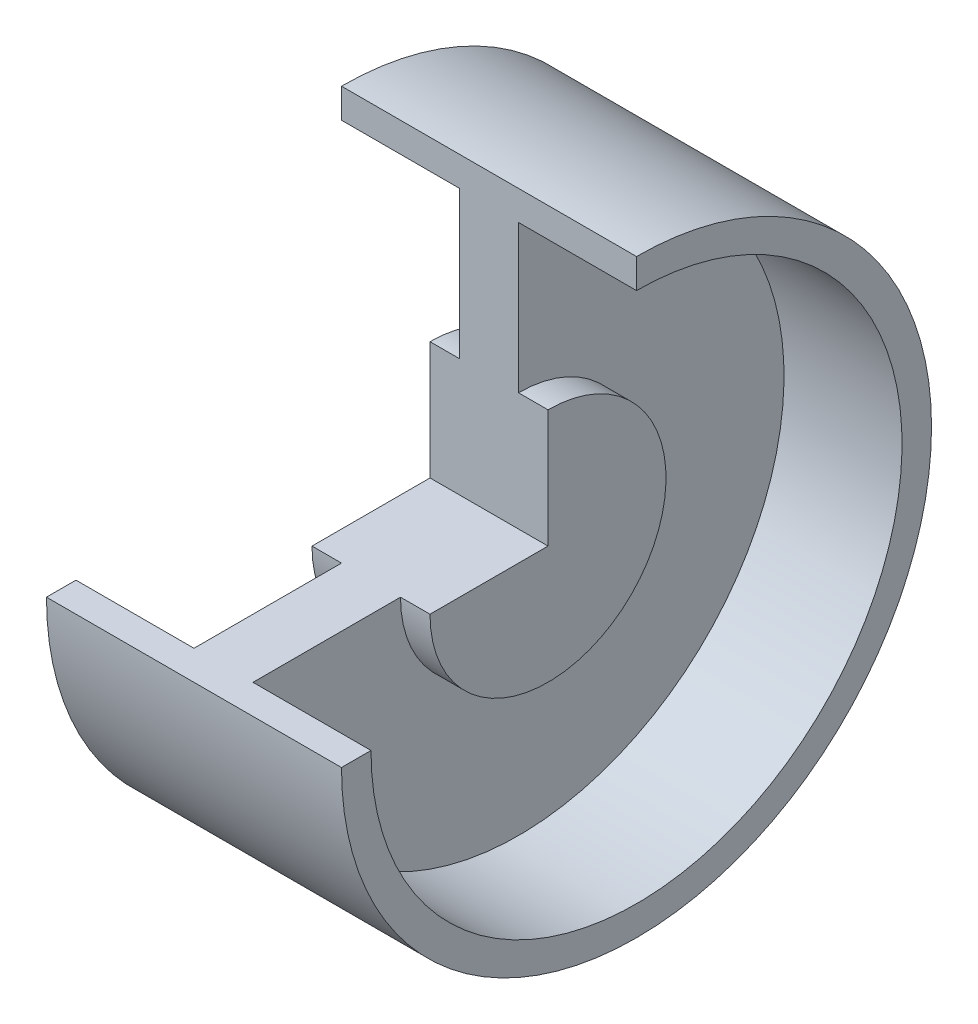
ISO-10303-21;
HEADER;
FILE_DESCRIPTION(('STEP AP214'),'2;1');
FILE_NAME('part.step','',(''),(''),'','','');
FILE_SCHEMA(('AUTOMOTIVE_DESIGN { 1 0 10303 214 1 1 1 1 }'));
ENDSEC;
DATA;
#1=APPLICATION_CONTEXT('core data for automotive mechanical design processes');
#2=APPLICATION_PROTOCOL_DEFINITION('international standard','automotive_design',2000,#1);
#3=PRODUCT_CONTEXT('',#1,'mechanical');
#4=PRODUCT('Part','Part','',(#3));
#5=PRODUCT_RELATED_PRODUCT_CATEGORY('part','',(#4));
#6=PRODUCT_DEFINITION_FORMATION('','',#4);
#7=PRODUCT_DEFINITION_CONTEXT('part definition',#1,'design');
#8=PRODUCT_DEFINITION('design','',#6,#7);
#9=PRODUCT_DEFINITION_SHAPE('','',#8);
#10=(LENGTH_UNIT() NAMED_UNIT(*) SI_UNIT(.MILLI.,.METRE.));
#11=(NAMED_UNIT(*) PLANE_ANGLE_UNIT() SI_UNIT($,.RADIAN.));
#12=(NAMED_UNIT(*) SI_UNIT($,.STERADIAN.) SOLID_ANGLE_UNIT());
#13=UNCERTAINTY_MEASURE_WITH_UNIT(LENGTH_MEASURE(1.E-05),#10,'distance_accuracy_value','');
#14=(GEOMETRIC_REPRESENTATION_CONTEXT(3) GLOBAL_UNCERTAINTY_ASSIGNED_CONTEXT((#13)) GLOBAL_UNIT_ASSIGNED_CONTEXT((#10,
#11,#12)) REPRESENTATION_CONTEXT('',''));
#15=CARTESIAN_POINT('',(0.,0.,0.));
#16=DIRECTION('',(0.,0.,1.));
#17=DIRECTION('',(1.,0.,0.));
#18=AXIS2_PLACEMENT_3D('',#15,#16,#17);
#19=CARTESIAN_POINT('',(-10.,0.,0.));
#20=DIRECTION('',(1.,0.,0.));
#21=DIRECTION('',(0.,1.,0.));
#22=AXIS2_PLACEMENT_3D('',#19,#20,#21);
#23=CYLINDRICAL_SURFACE('',#22,20.);
#24=CARTESIAN_POINT('',(-10.,0.,0.));
#25=DIRECTION('',(1.,0.,0.));
#26=DIRECTION('',(0.,1.,0.));
#27=AXIS2_PLACEMENT_3D('',#24,#25,#26);
#28=CIRCLE('',#27,20.);
#29=CARTESIAN_POINT('',(-10.,2.09488880330588E-13,20.));
#30=VERTEX_POINT('',#29);
#31=CARTESIAN_POINT('',(-10.,20.,0.));
#32=VERTEX_POINT('',#31);
#33=EDGE_CURVE('E11',#30,#32,#28,.T.);
#34=ORIENTED_EDGE('',*,*,#33,.T.);
#35=DIRECTION('',(-1.,0.,0.));
#36=VECTOR('',#35,1.);
#37=CARTESIAN_POINT('',(-5.,20.,0.));
#38=LINE('',#37,#36);
#39=CARTESIAN_POINT('',(-5.,20.,0.));
#40=VERTEX_POINT('',#39);
#41=EDGE_CURVE('E128',#40,#32,#38,.T.);
#42=ORIENTED_EDGE('',*,*,#41,.F.);
#43=CARTESIAN_POINT('',(-4.99999999999999,0.,0.));
#44=DIRECTION('',(1.,0.,0.));
#45=DIRECTION('',(0.,1.,0.));
#46=AXIS2_PLACEMENT_3D('',#43,#44,#45);
#47=CIRCLE('',#46,20.);
#48=CARTESIAN_POINT('',(-4.99999999999999,2.10737743309124E-13,20.));
#49=VERTEX_POINT('',#48);
#50=EDGE_CURVE('E61',#49,#40,#47,.T.);
#51=ORIENTED_EDGE('',*,*,#50,.F.);
#52=DIRECTION('',(-1.,0.,0.));
#53=VECTOR('',#52,1.);
#54=CARTESIAN_POINT('',(-4.99999999999999,2.10737743309124E-13,20.));
#55=LINE('',#54,#53);
#56=EDGE_CURVE('E130',#49,#30,#55,.T.);
#57=ORIENTED_EDGE('',*,*,#56,.T.);
#58=EDGE_LOOP('',(#34,#42,#51,#57));
#59=FACE_BOUND('',#58,.T.);
#60=ADVANCED_FACE('F45',(#59),#23,.T.);
#61=CARTESIAN_POINT('',(-10.,2.09488880330588E-13,20.));
#62=DIRECTION('',(-1.,0.,0.));
#63=DIRECTION('',(0.,-1.,0.));
#64=AXIS2_PLACEMENT_3D('',#61,#62,#63);
#65=PLANE('',#64);
#66=DIRECTION('',(0.,-1.,0.));
#67=VECTOR('',#66,1.);
#68=CARTESIAN_POINT('',(-10.,20.,0.));
#69=LINE('',#68,#67);
#70=CARTESIAN_POINT('',(-10.,0.,0.));
#71=VERTEX_POINT('',#70);
#72=EDGE_CURVE('E139',#32,#71,#69,.T.);
#73=ORIENTED_EDGE('',*,*,#72,.F.);
#74=ORIENTED_EDGE('',*,*,#33,.F.);
#75=DIRECTION('',(0.,0.,-1.));
#76=VECTOR('',#75,1.);
#77=CARTESIAN_POINT('',(-10.,2.09488880330588E-13,20.));
#78=LINE('',#77,#76);
#79=EDGE_CURVE('E144',#30,#71,#78,.T.);
#80=ORIENTED_EDGE('',*,*,#79,.T.);
#81=EDGE_LOOP('',(#73,#74,#80));
#82=FACE_BOUND('',#81,.T.);
#83=ADVANCED_FACE('F47',(#82),#65,.T.);
#84=CARTESIAN_POINT('',(10.,0.,0.));
#85=DIRECTION('',(1.,0.,0.));
#86=DIRECTION('',(0.,1.,0.));
#87=AXIS2_PLACEMENT_3D('',#84,#85,#86);
#88=PLANE('',#87);
#89=CARTESIAN_POINT('',(10.,0.,0.));
#90=DIRECTION('',(1.,0.,0.));
#91=DIRECTION('',(0.,1.,0.));
#92=AXIS2_PLACEMENT_3D('',#89,#90,#91);
#93=CIRCLE('',#92,20.);
#94=CARTESIAN_POINT('',(10.,2.14484332244731E-13,20.));
#95=VERTEX_POINT('',#94);
#96=CARTESIAN_POINT('',(10.,20.,0.));
#97=VERTEX_POINT('',#96);
#98=EDGE_CURVE('E54',#95,#97,#93,.T.);
#99=ORIENTED_EDGE('',*,*,#98,.T.);
#100=DIRECTION('',(0.,1.,0.));
#101=VECTOR('',#100,1.);
#102=CARTESIAN_POINT('',(10.,0.,0.));
#103=LINE('',#102,#101);
#104=CARTESIAN_POINT('',(10.,0.,0.));
#105=VERTEX_POINT('',#104);
#106=EDGE_CURVE('E146',#105,#97,#103,.T.);
#107=ORIENTED_EDGE('',*,*,#106,.F.);
#108=DIRECTION('',(0.,0.,1.));
#109=VECTOR('',#108,1.);
#110=CARTESIAN_POINT('',(10.,0.,0.));
#111=LINE('',#110,#109);
#112=EDGE_CURVE('E188',#105,#95,#111,.T.);
#113=ORIENTED_EDGE('',*,*,#112,.T.);
#114=EDGE_LOOP('',(#99,#107,#113));
#115=FACE_BOUND('',#114,.T.);
#116=ADVANCED_FACE('F245',(#115),#88,.T.);
#117=CARTESIAN_POINT('',(-10.,0.,0.));
#118=DIRECTION('',(1.,0.,0.));
#119=DIRECTION('',(0.,1.,0.));
#120=AXIS2_PLACEMENT_3D('',#117,#118,#119);
#121=CYLINDRICAL_SURFACE('',#120,20.);
#122=CARTESIAN_POINT('',(5.00000000000001,0.,0.));
#123=DIRECTION('',(1.,0.,0.));
#124=DIRECTION('',(0.,1.,0.));
#125=AXIS2_PLACEMENT_3D('',#122,#123,#124);
#126=CIRCLE('',#125,20.);
#127=CARTESIAN_POINT('',(5.00000000000001,2.13235469266195E-13,20.));
#128=VERTEX_POINT('',#127);
#129=CARTESIAN_POINT('',(5.,20.,0.));
#130=VERTEX_POINT('',#129);
#131=EDGE_CURVE('E241',#128,#130,#126,.T.);
#132=ORIENTED_EDGE('',*,*,#131,.T.);
#133=DIRECTION('',(-1.,0.,0.));
#134=VECTOR('',#133,1.);
#135=CARTESIAN_POINT('',(10.,20.,0.));
#136=LINE('',#135,#134);
#137=EDGE_CURVE('E150',#97,#130,#136,.T.);
#138=ORIENTED_EDGE('',*,*,#137,.F.);
#139=ORIENTED_EDGE('',*,*,#98,.F.);
#140=DIRECTION('',(-1.,0.,0.));
#141=VECTOR('',#140,1.);
#142=CARTESIAN_POINT('',(10.,2.14484332244731E-13,20.));
#143=LINE('',#142,#141);
#144=EDGE_CURVE('E192',#95,#128,#143,.T.);
#145=ORIENTED_EDGE('',*,*,#144,.T.);
#146=EDGE_LOOP('',(#132,#138,#139,#145));
#147=FACE_BOUND('',#146,.T.);
#148=ADVANCED_FACE('F251',(#147),#121,.T.);
#149=CARTESIAN_POINT('',(5.00000000000001,2.13235469266195E-13,20.));
#150=DIRECTION('',(1.,0.,0.));
#151=DIRECTION('',(0.,1.,0.));
#152=AXIS2_PLACEMENT_3D('',#149,#150,#151);
#153=PLANE('',#152);
#154=CARTESIAN_POINT('',(5.00000000000002,0.,0.));
#155=DIRECTION('',(1.,0.,0.));
#156=DIRECTION('',(0.,1.,0.));
#157=AXIS2_PLACEMENT_3D('',#154,#155,#156);
#158=CIRCLE('',#157,45.);
#159=CARTESIAN_POINT('',(5.00000000000002,4.7509656967943E-13,45.));
#160=VERTEX_POINT('',#159);
#161=CARTESIAN_POINT('',(5.,45.,0.));
#162=VERTEX_POINT('',#161);
#163=EDGE_CURVE('E238',#160,#162,#158,.T.);
#164=ORIENTED_EDGE('',*,*,#163,.T.);
#165=DIRECTION('',(0.,1.,0.));
#166=VECTOR('',#165,1.);
#167=CARTESIAN_POINT('',(5.,20.,0.));
#168=LINE('',#167,#166);
#169=EDGE_CURVE('E156',#130,#162,#168,.T.);
#170=ORIENTED_EDGE('',*,*,#169,.F.);
#171=ORIENTED_EDGE('',*,*,#131,.F.);
#172=DIRECTION('',(0.,0.,1.));
#173=VECTOR('',#172,1.);
#174=CARTESIAN_POINT('',(5.00000000000001,2.13235469266195E-13,20.));
#175=LINE('',#174,#173);
#176=EDGE_CURVE('E196',#128,#160,#175,.T.);
#177=ORIENTED_EDGE('',*,*,#176,.T.);
#178=EDGE_LOOP('',(#164,#170,#171,#177));
#179=FACE_BOUND('',#178,.T.);
#180=ADVANCED_FACE('F254',(#179),#153,.T.);
#181=CARTESIAN_POINT('',(-10.,0.,0.));
#182=DIRECTION('',(1.,0.,0.));
#183=DIRECTION('',(0.,1.,0.));
#184=AXIS2_PLACEMENT_3D('',#181,#182,#183);
#185=CYLINDRICAL_SURFACE('',#184,45.);
#186=CARTESIAN_POINT('',(25.,0.,0.));
#187=DIRECTION('',(1.,0.,0.));
#188=DIRECTION('',(0.,1.,0.));
#189=AXIS2_PLACEMENT_3D('',#186,#187,#188);
#190=CIRCLE('',#189,45.);
#191=CARTESIAN_POINT('',(25.,4.80092021593572E-13,45.));
#192=VERTEX_POINT('',#191);
#193=CARTESIAN_POINT('',(25.,45.,0.));
#194=VERTEX_POINT('',#193);
#195=EDGE_CURVE('E235',#192,#194,#190,.T.);
#196=ORIENTED_EDGE('',*,*,#195,.T.);
#197=DIRECTION('',(1.,0.,0.));
#198=VECTOR('',#197,1.);
#199=CARTESIAN_POINT('',(5.,45.,0.));
#200=LINE('',#199,#198);
#201=EDGE_CURVE('E160',#162,#194,#200,.T.);
#202=ORIENTED_EDGE('',*,*,#201,.F.);
#203=ORIENTED_EDGE('',*,*,#163,.F.);
#204=DIRECTION('',(1.,0.,0.));
#205=VECTOR('',#204,1.);
#206=CARTESIAN_POINT('',(5.00000000000002,4.7509656967943E-13,45.));
#207=LINE('',#206,#205);
#208=EDGE_CURVE('E200',#160,#192,#207,.T.);
#209=ORIENTED_EDGE('',*,*,#208,.T.);
#210=EDGE_LOOP('',(#196,#202,#203,#209));
#211=FACE_BOUND('',#210,.T.);
#212=ADVANCED_FACE('F259',(#211),#185,.F.);
#213=CARTESIAN_POINT('',(25.,4.80092021593572E-13,45.));
#214=DIRECTION('',(1.,0.,0.));
#215=DIRECTION('',(0.,1.,0.));
#216=AXIS2_PLACEMENT_3D('',#213,#214,#215);
#217=PLANE('',#216);
#218=CARTESIAN_POINT('',(25.,0.,0.));
#219=DIRECTION('',(1.,0.,0.));
#220=DIRECTION('',(0.,1.,0.));
#221=AXIS2_PLACEMENT_3D('',#218,#219,#220);
#222=CIRCLE('',#221,50.);
#223=CARTESIAN_POINT('',(25.,5.32464241676219E-13,50.));
#224=VERTEX_POINT('',#223);
#225=CARTESIAN_POINT('',(25.,50.,0.));
#226=VERTEX_POINT('',#225);
#227=EDGE_CURVE('E232',#224,#226,#222,.T.);
#228=ORIENTED_EDGE('',*,*,#227,.T.);
#229=DIRECTION('',(0.,1.,0.));
#230=VECTOR('',#229,1.);
#231=CARTESIAN_POINT('',(25.,45.,0.));
#232=LINE('',#231,#230);
#233=EDGE_CURVE('E164',#194,#226,#232,.T.);
#234=ORIENTED_EDGE('',*,*,#233,.F.);
#235=ORIENTED_EDGE('',*,*,#195,.F.);
#236=DIRECTION('',(0.,0.,1.));
#237=VECTOR('',#236,1.);
#238=CARTESIAN_POINT('',(25.,4.80092021593572E-13,45.));
#239=LINE('',#238,#237);
#240=EDGE_CURVE('E204',#192,#224,#239,.T.);
#241=ORIENTED_EDGE('',*,*,#240,.T.);
#242=EDGE_LOOP('',(#228,#234,#235,#241));
#243=FACE_BOUND('',#242,.T.);
#244=ADVANCED_FACE('F262',(#243),#217,.T.);
#245=CARTESIAN_POINT('',(-10.,0.,0.));
#246=DIRECTION('',(1.,0.,0.));
#247=DIRECTION('',(0.,1.,0.));
#248=AXIS2_PLACEMENT_3D('',#245,#246,#247);
#249=CYLINDRICAL_SURFACE('',#248,50.);
#250=CARTESIAN_POINT('',(-25.,0.,0.));
#251=DIRECTION('',(1.,0.,0.));
#252=DIRECTION('',(0.,1.,0.));
#253=AXIS2_PLACEMENT_3D('',#250,#251,#252);
#254=CIRCLE('',#253,50.);
#255=CARTESIAN_POINT('',(-25.,5.19975611890863E-13,50.));
#256=VERTEX_POINT('',#255);
#257=CARTESIAN_POINT('',(-25.,50.,0.));
#258=VERTEX_POINT('',#257);
#259=EDGE_CURVE('E229',#256,#258,#254,.T.);
#260=ORIENTED_EDGE('',*,*,#259,.T.);
#261=DIRECTION('',(-1.,0.,0.));
#262=VECTOR('',#261,1.);
#263=CARTESIAN_POINT('',(25.,50.,0.));
#264=LINE('',#263,#262);
#265=EDGE_CURVE('E168',#226,#258,#264,.T.);
#266=ORIENTED_EDGE('',*,*,#265,.F.);
#267=ORIENTED_EDGE('',*,*,#227,.F.);
#268=DIRECTION('',(-1.,0.,0.));
#269=VECTOR('',#268,1.);
#270=CARTESIAN_POINT('',(25.,5.32464241676219E-13,50.));
#271=LINE('',#270,#269);
#272=EDGE_CURVE('E208',#224,#256,#271,.T.);
#273=ORIENTED_EDGE('',*,*,#272,.T.);
#274=EDGE_LOOP('',(#260,#266,#267,#273));
#275=FACE_BOUND('',#274,.T.);
#276=ADVANCED_FACE('F267',(#275),#249,.T.);
#277=CARTESIAN_POINT('',(-25.,5.19975611890863E-13,50.));
#278=DIRECTION('',(-1.,0.,0.));
#279=DIRECTION('',(0.,-1.,0.));
#280=AXIS2_PLACEMENT_3D('',#277,#278,#279);
#281=PLANE('',#280);
#282=CARTESIAN_POINT('',(-25.,0.,0.));
#283=DIRECTION('',(1.,0.,0.));
#284=DIRECTION('',(0.,1.,0.));
#285=AXIS2_PLACEMENT_3D('',#282,#283,#284);
#286=CIRCLE('',#285,45.);
#287=CARTESIAN_POINT('',(-25.,4.67603391808216E-13,45.));
#288=VERTEX_POINT('',#287);
#289=CARTESIAN_POINT('',(-25.,45.,0.));
#290=VERTEX_POINT('',#289);
#291=EDGE_CURVE('E226',#288,#290,#286,.T.);
#292=ORIENTED_EDGE('',*,*,#291,.T.);
#293=DIRECTION('',(0.,-1.,0.));
#294=VECTOR('',#293,1.);
#295=CARTESIAN_POINT('',(-25.,50.,0.));
#296=LINE('',#295,#294);
#297=EDGE_CURVE('E172',#258,#290,#296,.T.);
#298=ORIENTED_EDGE('',*,*,#297,.F.);
#299=ORIENTED_EDGE('',*,*,#259,.F.);
#300=DIRECTION('',(0.,0.,-1.));
#301=VECTOR('',#300,1.);
#302=CARTESIAN_POINT('',(-25.,5.19975611890863E-13,50.));
#303=LINE('',#302,#301);
#304=EDGE_CURVE('E212',#256,#288,#303,.T.);
#305=ORIENTED_EDGE('',*,*,#304,.T.);
#306=EDGE_LOOP('',(#292,#298,#299,#305));
#307=FACE_BOUND('',#306,.T.);
#308=ADVANCED_FACE('F270',(#307),#281,.T.);
#309=CARTESIAN_POINT('',(-10.,0.,0.));
#310=DIRECTION('',(1.,0.,0.));
#311=DIRECTION('',(0.,1.,0.));
#312=AXIS2_PLACEMENT_3D('',#309,#310,#311);
#313=CYLINDRICAL_SURFACE('',#312,45.);
#314=CARTESIAN_POINT('',(-4.99999999999999,0.,0.));
#315=DIRECTION('',(1.,0.,0.));
#316=DIRECTION('',(0.,1.,0.));
#317=AXIS2_PLACEMENT_3D('',#314,#315,#316);
#318=CIRCLE('',#317,45.);
#319=CARTESIAN_POINT('',(-4.99999999999999,4.72598843722359E-13,45.));
#320=VERTEX_POINT('',#319);
#321=CARTESIAN_POINT('',(-5.,45.,0.));
#322=VERTEX_POINT('',#321);
#323=EDGE_CURVE('E69',#320,#322,#318,.T.);
#324=ORIENTED_EDGE('',*,*,#323,.T.);
#325=DIRECTION('',(1.,0.,0.));
#326=VECTOR('',#325,1.);
#327=CARTESIAN_POINT('',(-25.,45.,0.));
#328=LINE('',#327,#326);
#329=EDGE_CURVE('E176',#290,#322,#328,.T.);
#330=ORIENTED_EDGE('',*,*,#329,.F.);
#331=ORIENTED_EDGE('',*,*,#291,.F.);
#332=DIRECTION('',(1.,0.,0.));
#333=VECTOR('',#332,1.);
#334=CARTESIAN_POINT('',(-25.,4.67603391808216E-13,45.));
#335=LINE('',#334,#333);
#336=EDGE_CURVE('E216',#288,#320,#335,.T.);
#337=ORIENTED_EDGE('',*,*,#336,.T.);
#338=EDGE_LOOP('',(#324,#330,#331,#337));
#339=FACE_BOUND('',#338,.T.);
#340=ADVANCED_FACE('F274',(#339),#313,.F.);
#341=CARTESIAN_POINT('',(-4.99999999999999,4.72598843722359E-13,45.));
#342=DIRECTION('',(-1.,0.,0.));
#343=DIRECTION('',(0.,-1.,0.));
#344=AXIS2_PLACEMENT_3D('',#341,#342,#343);
#345=PLANE('',#344);
#346=DIRECTION('',(0.,0.,-1.));
#347=VECTOR('',#346,1.);
#348=CARTESIAN_POINT('',(-4.99999999999999,4.72598843722359E-13,45.));
#349=LINE('',#348,#347);
#350=EDGE_CURVE('E219',#320,#49,#349,.T.);
#351=ORIENTED_EDGE('',*,*,#350,.T.);
#352=ORIENTED_EDGE('',*,*,#50,.T.);
#353=DIRECTION('',(0.,-1.,0.));
#354=VECTOR('',#353,1.);
#355=CARTESIAN_POINT('',(-5.,45.,0.));
#356=LINE('',#355,#354);
#357=EDGE_CURVE('E141',#322,#40,#356,.T.);
#358=ORIENTED_EDGE('',*,*,#357,.F.);
#359=ORIENTED_EDGE('',*,*,#323,.F.);
#360=EDGE_LOOP('',(#351,#352,#358,#359));
#361=FACE_BOUND('',#360,.T.);
#362=ADVANCED_FACE('F278',(#361),#345,.T.);
#363=CARTESIAN_POINT('',(0.,0.,0.));
#364=DIRECTION('',(0.,-1.,0.));
#365=DIRECTION('',(1.,0.,0.));
#366=AXIS2_PLACEMENT_3D('',#363,#364,#365);
#367=PLANE('',#366);
#368=ORIENTED_EDGE('',*,*,#56,.F.);
#369=ORIENTED_EDGE('',*,*,#350,.F.);
#370=ORIENTED_EDGE('',*,*,#336,.F.);
#371=ORIENTED_EDGE('',*,*,#304,.F.);
#372=ORIENTED_EDGE('',*,*,#272,.F.);
#373=ORIENTED_EDGE('',*,*,#240,.F.);
#374=ORIENTED_EDGE('',*,*,#208,.F.);
#375=ORIENTED_EDGE('',*,*,#176,.F.);
#376=ORIENTED_EDGE('',*,*,#144,.F.);
#377=ORIENTED_EDGE('',*,*,#112,.F.);
#378=DIRECTION('',(1.,0.,0.));
#379=VECTOR('',#378,1.);
#380=CARTESIAN_POINT('',(-10.,0.,0.));
#381=LINE('',#380,#379);
#382=EDGE_CURVE('E185',#71,#105,#381,.T.);
#383=ORIENTED_EDGE('',*,*,#382,.F.);
#384=ORIENTED_EDGE('',*,*,#79,.F.);
#385=EDGE_LOOP('',(#368,#369,#370,#371,#372,#373,#374,#375,#376,#377,#383,#384));
#386=FACE_BOUND('',#385,.T.);
#387=ADVANCED_FACE('F277',(#386),#367,.F.);
#388=CARTESIAN_POINT('',(0.,0.,0.));
#389=DIRECTION('',(0.,0.,1.));
#390=DIRECTION('',(1.,0.,0.));
#391=AXIS2_PLACEMENT_3D('',#388,#389,#390);
#392=PLANE('',#391);
#393=ORIENTED_EDGE('',*,*,#41,.T.);
#394=ORIENTED_EDGE('',*,*,#72,.T.);
#395=ORIENTED_EDGE('',*,*,#382,.T.);
#396=ORIENTED_EDGE('',*,*,#106,.T.);
#397=ORIENTED_EDGE('',*,*,#137,.T.);
#398=ORIENTED_EDGE('',*,*,#169,.T.);
#399=ORIENTED_EDGE('',*,*,#201,.T.);
#400=ORIENTED_EDGE('',*,*,#233,.T.);
#401=ORIENTED_EDGE('',*,*,#265,.T.);
#402=ORIENTED_EDGE('',*,*,#297,.T.);
#403=ORIENTED_EDGE('',*,*,#329,.T.);
#404=ORIENTED_EDGE('',*,*,#357,.T.);
#405=EDGE_LOOP('',(#393,#394,#395,#396,#397,#398,#399,#400,#401,#402,#403,#404));
#406=FACE_BOUND('',#405,.T.);
#407=ADVANCED_FACE('F137',(#406),#392,.T.);
#408=CLOSED_SHELL('',(#60,#83,#116,#148,#180,#212,#244,#276,#308,#340,#362,#387,#407));
#409=MANIFOLD_SOLID_BREP('B2',#408);
#410=ADVANCED_BREP_SHAPE_REPRESENTATION('',(#18,#409),#14);
#411=SHAPE_DEFINITION_REPRESENTATION(#9,#410);
ENDSEC;
END-ISO-10303-21;
